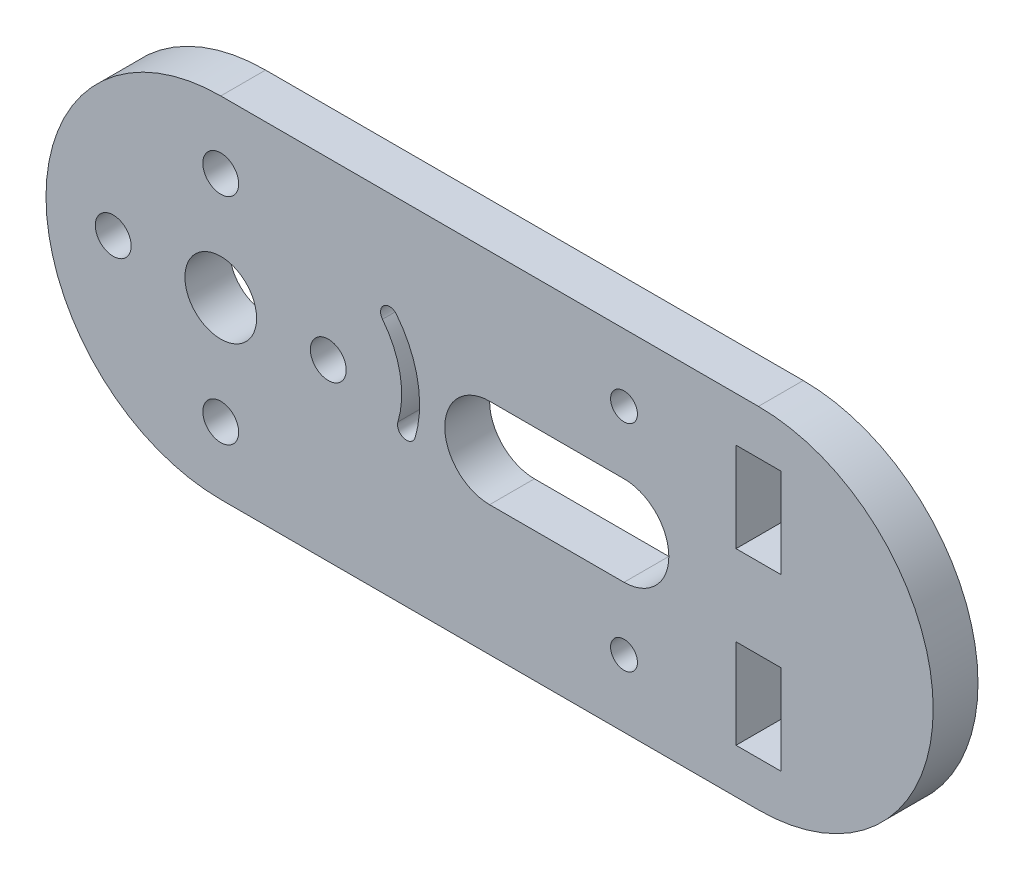
ISO-10303-21;
HEADER;
FILE_DESCRIPTION(('STEP AP214'),'2;1');
FILE_NAME('part.step','',(''),(''),'','','');
FILE_SCHEMA(('AUTOMOTIVE_DESIGN { 1 0 10303 214 1 1 1 1 }'));
ENDSEC;
DATA;
#1=APPLICATION_CONTEXT('core data for automotive mechanical design processes');
#2=APPLICATION_PROTOCOL_DEFINITION('international standard','automotive_design',2000,#1);
#3=PRODUCT_CONTEXT('',#1,'mechanical');
#4=PRODUCT('Part','Part','',(#3));
#5=PRODUCT_RELATED_PRODUCT_CATEGORY('part','',(#4));
#6=PRODUCT_DEFINITION_FORMATION('','',#4);
#7=PRODUCT_DEFINITION_CONTEXT('part definition',#1,'design');
#8=PRODUCT_DEFINITION('design','',#6,#7);
#9=PRODUCT_DEFINITION_SHAPE('','',#8);
#10=(LENGTH_UNIT() NAMED_UNIT(*) SI_UNIT(.MILLI.,.METRE.));
#11=(NAMED_UNIT(*) PLANE_ANGLE_UNIT() SI_UNIT($,.RADIAN.));
#12=(NAMED_UNIT(*) SI_UNIT($,.STERADIAN.) SOLID_ANGLE_UNIT());
#13=UNCERTAINTY_MEASURE_WITH_UNIT(LENGTH_MEASURE(1.E-05),#10,'distance_accuracy_value','');
#14=(GEOMETRIC_REPRESENTATION_CONTEXT(3) GLOBAL_UNCERTAINTY_ASSIGNED_CONTEXT((#13)) GLOBAL_UNIT_ASSIGNED_CONTEXT((#10,
#11,#12)) REPRESENTATION_CONTEXT('',''));
#15=CARTESIAN_POINT('',(0.,0.,0.));
#16=DIRECTION('',(0.,0.,1.));
#17=DIRECTION('',(1.,0.,0.));
#18=AXIS2_PLACEMENT_3D('',#15,#16,#17);
#19=CARTESIAN_POINT('',(-30.,0.,5.));
#20=DIRECTION('',(0.,0.,1.));
#21=DIRECTION('',(1.,0.,0.));
#22=AXIS2_PLACEMENT_3D('',#19,#20,#21);
#23=PLANE('',#22);
#24=CARTESIAN_POINT('',(15.,12.,5.));
#25=DIRECTION('',(0.,0.,1.));
#26=DIRECTION('',(1.,0.,0.));
#27=AXIS2_PLACEMENT_3D('',#24,#25,#26);
#28=CIRCLE('',#27,1.5);
#29=CARTESIAN_POINT('',(16.5,12.,5.));
#30=VERTEX_POINT('',#29);
#31=EDGE_CURVE('E304',#30,#30,#28,.T.);
#32=ORIENTED_EDGE('',*,*,#31,.F.);
#33=EDGE_LOOP('',(#32));
#34=FACE_BOUND('',#33,.T.);
#35=CARTESIAN_POINT('',(-30.,-12.,5.));
#36=DIRECTION('',(0.,0.,1.));
#37=DIRECTION('',(1.,0.,0.));
#38=AXIS2_PLACEMENT_3D('',#35,#36,#37);
#39=CIRCLE('',#38,2.);
#40=CARTESIAN_POINT('',(-28.,-12.,5.));
#41=VERTEX_POINT('',#40);
#42=EDGE_CURVE('E316',#41,#41,#39,.T.);
#43=ORIENTED_EDGE('',*,*,#42,.F.);
#44=EDGE_LOOP('',(#43));
#45=FACE_BOUND('',#44,.T.);
#46=CARTESIAN_POINT('',(-30.,12.,5.));
#47=DIRECTION('',(0.,0.,1.));
#48=DIRECTION('',(1.,0.,0.));
#49=AXIS2_PLACEMENT_3D('',#46,#47,#48);
#50=CIRCLE('',#49,2.);
#51=CARTESIAN_POINT('',(-28.,12.,5.));
#52=VERTEX_POINT('',#51);
#53=EDGE_CURVE('E328',#52,#52,#50,.T.);
#54=ORIENTED_EDGE('',*,*,#53,.F.);
#55=EDGE_LOOP('',(#54));
#56=FACE_BOUND('',#55,.T.);
#57=CARTESIAN_POINT('',(-30.,0.,5.));
#58=DIRECTION('',(0.,0.,1.));
#59=DIRECTION('',(1.,0.,0.));
#60=AXIS2_PLACEMENT_3D('',#57,#58,#59);
#61=CIRCLE('',#60,19.5);
#62=CARTESIAN_POINT('',(-30.,19.5,5.));
#63=VERTEX_POINT('',#62);
#64=CARTESIAN_POINT('',(-30.,-19.5,5.));
#65=VERTEX_POINT('',#64);
#66=EDGE_CURVE('E340',#63,#65,#61,.T.);
#67=ORIENTED_EDGE('',*,*,#66,.T.);
#68=DIRECTION('',(1.,0.,0.));
#69=VECTOR('',#68,1.);
#70=CARTESIAN_POINT('',(-30.,-19.5,5.));
#71=LINE('',#70,#69);
#72=CARTESIAN_POINT('',(30.,-19.5,5.));
#73=VERTEX_POINT('',#72);
#74=EDGE_CURVE('E343',#65,#73,#71,.T.);
#75=ORIENTED_EDGE('',*,*,#74,.T.);
#76=CARTESIAN_POINT('',(30.,0.,5.));
#77=DIRECTION('',(0.,0.,1.));
#78=DIRECTION('',(1.,0.,0.));
#79=AXIS2_PLACEMENT_3D('',#76,#77,#78);
#80=CIRCLE('',#79,19.5);
#81=CARTESIAN_POINT('',(30.,19.5,5.));
#82=VERTEX_POINT('',#81);
#83=EDGE_CURVE('E346',#73,#82,#80,.T.);
#84=ORIENTED_EDGE('',*,*,#83,.T.);
#85=DIRECTION('',(-1.,0.,0.));
#86=VECTOR('',#85,1.);
#87=CARTESIAN_POINT('',(-30.,19.5,5.));
#88=LINE('',#87,#86);
#89=EDGE_CURVE('E348',#82,#63,#88,.T.);
#90=ORIENTED_EDGE('',*,*,#89,.T.);
#91=EDGE_LOOP('',(#67,#75,#84,#90));
#92=FACE_BOUND('',#91,.T.);
#93=CARTESIAN_POINT('',(-30.,0.,5.));
#94=DIRECTION('',(0.,0.,1.));
#95=DIRECTION('',(1.,0.,0.));
#96=AXIS2_PLACEMENT_3D('',#93,#94,#95);
#97=CIRCLE('',#96,4.);
#98=CARTESIAN_POINT('',(-26.,0.,5.));
#99=VERTEX_POINT('',#98);
#100=EDGE_CURVE('E334',#99,#99,#97,.T.);
#101=ORIENTED_EDGE('',*,*,#100,.F.);
#102=EDGE_LOOP('',(#101));
#103=FACE_BOUND('',#102,.T.);
#104=CARTESIAN_POINT('',(-18.,0.,5.));
#105=DIRECTION('',(0.,0.,1.));
#106=DIRECTION('',(1.,0.,0.));
#107=AXIS2_PLACEMENT_3D('',#104,#105,#106);
#108=CIRCLE('',#107,2.);
#109=CARTESIAN_POINT('',(-16.,0.,5.));
#110=VERTEX_POINT('',#109);
#111=EDGE_CURVE('E322',#110,#110,#108,.T.);
#112=ORIENTED_EDGE('',*,*,#111,.F.);
#113=EDGE_LOOP('',(#112));
#114=FACE_BOUND('',#113,.T.);
#115=CARTESIAN_POINT('',(-42.,0.,5.));
#116=DIRECTION('',(0.,0.,1.));
#117=DIRECTION('',(1.,0.,0.));
#118=AXIS2_PLACEMENT_3D('',#115,#116,#117);
#119=CIRCLE('',#118,2.);
#120=CARTESIAN_POINT('',(-40.,0.,5.));
#121=VERTEX_POINT('',#120);
#122=EDGE_CURVE('E310',#121,#121,#119,.T.);
#123=ORIENTED_EDGE('',*,*,#122,.F.);
#124=EDGE_LOOP('',(#123));
#125=FACE_BOUND('',#124,.T.);
#126=CARTESIAN_POINT('',(15.,-12.,5.));
#127=DIRECTION('',(0.,0.,1.));
#128=DIRECTION('',(1.,0.,0.));
#129=AXIS2_PLACEMENT_3D('',#126,#127,#128);
#130=CIRCLE('',#129,1.5);
#131=CARTESIAN_POINT('',(16.5,-12.,5.));
#132=VERTEX_POINT('',#131);
#133=EDGE_CURVE('E298',#132,#132,#130,.T.);
#134=ORIENTED_EDGE('',*,*,#133,.F.);
#135=EDGE_LOOP('',(#134));
#136=FACE_BOUND('',#135,.T.);
#137=DIRECTION('',(-1.,0.,0.));
#138=VECTOR('',#137,1.);
#139=CARTESIAN_POINT('',(15.,5.,5.));
#140=LINE('',#139,#138);
#141=CARTESIAN_POINT('',(15.,5.,5.));
#142=VERTEX_POINT('',#141);
#143=CARTESIAN_POINT('',(0.,5.,5.));
#144=VERTEX_POINT('',#143);
#145=EDGE_CURVE('E269',#142,#144,#140,.T.);
#146=ORIENTED_EDGE('',*,*,#145,.F.);
#147=CARTESIAN_POINT('',(15.,0.,5.));
#148=DIRECTION('',(0.,0.,1.));
#149=DIRECTION('',(1.,0.,0.));
#150=AXIS2_PLACEMENT_3D('',#147,#148,#149);
#151=CIRCLE('',#150,5.);
#152=CARTESIAN_POINT('',(15.,-5.,5.));
#153=VERTEX_POINT('',#152);
#154=EDGE_CURVE('E267',#153,#142,#151,.T.);
#155=ORIENTED_EDGE('',*,*,#154,.F.);
#156=DIRECTION('',(1.,0.,0.));
#157=VECTOR('',#156,1.);
#158=CARTESIAN_POINT('',(15.,-5.,5.));
#159=LINE('',#158,#157);
#160=CARTESIAN_POINT('',(0.,-5.,5.));
#161=VERTEX_POINT('',#160);
#162=EDGE_CURVE('E275',#161,#153,#159,.T.);
#163=ORIENTED_EDGE('',*,*,#162,.F.);
#164=CARTESIAN_POINT('',(0.,0.,5.));
#165=DIRECTION('',(0.,0.,1.));
#166=DIRECTION('',(1.,0.,0.));
#167=AXIS2_PLACEMENT_3D('',#164,#165,#166);
#168=CIRCLE('',#167,5.);
#169=EDGE_CURVE('E272',#144,#161,#168,.T.);
#170=ORIENTED_EDGE('',*,*,#169,.F.);
#171=EDGE_LOOP('',(#146,#155,#163,#170));
#172=FACE_BOUND('',#171,.T.);
#173=CARTESIAN_POINT('',(-9.27407063497389,-2.40670280144582,5.));
#174=DIRECTION('',(0.,0.,1.));
#175=DIRECTION('',(1.,0.,0.));
#176=AXIS2_PLACEMENT_3D('',#173,#174,#175);
#177=CIRCLE('',#176,1.);
#178=CARTESIAN_POINT('',(-10.231740031791,-2.11883247230441,5.));
#179=VERTEX_POINT('',#178);
#180=CARTESIAN_POINT('',(-8.31640123815679,-2.69457313058723,5.));
#181=VERTEX_POINT('',#180);
#182=EDGE_CURVE('E238',#179,#181,#177,.T.);
#183=ORIENTED_EDGE('',*,*,#182,.F.);
#184=CARTESIAN_POINT('',(-19.8084339999619,0.759870819109661,5.));
#185=DIRECTION('',(0.,0.,-1.));
#186=DIRECTION('',(1.,0.,0.));
#187=AXIS2_PLACEMENT_3D('',#184,#185,#186);
#188=CIRCLE('',#187,10.);
#189=CARTESIAN_POINT('',(-11.9503160834255,6.94452786779143,5.));
#190=VERTEX_POINT('',#189);
#191=EDGE_CURVE('E236',#190,#179,#188,.T.);
#192=ORIENTED_EDGE('',*,*,#191,.F.);
#193=CARTESIAN_POINT('',(-11.1645042917718,7.5629935726596,5.));
#194=DIRECTION('',(0.,0.,1.));
#195=DIRECTION('',(-1.,0.,0.));
#196=AXIS2_PLACEMENT_3D('',#193,#194,#195);
#197=CIRCLE('',#196,1.);
#198=CARTESIAN_POINT('',(-10.3786925001182,8.18145927752778,5.));
#199=VERTEX_POINT('',#198);
#200=EDGE_CURVE('E244',#199,#190,#197,.T.);
#201=ORIENTED_EDGE('',*,*,#200,.F.);
#202=CARTESIAN_POINT('',(-19.8084339999619,0.759870819109661,5.));
#203=DIRECTION('',(0.,0.,1.));
#204=DIRECTION('',(1.,0.,0.));
#205=AXIS2_PLACEMENT_3D('',#202,#203,#204);
#206=CIRCLE('',#205,12.);
#207=EDGE_CURVE('E241',#181,#199,#206,.T.);
#208=ORIENTED_EDGE('',*,*,#207,.F.);
#209=EDGE_LOOP('',(#183,#192,#201,#208));
#210=FACE_BOUND('',#209,.T.);
#211=DIRECTION('',(1.,0.,0.));
#212=VECTOR('',#211,1.);
#213=CARTESIAN_POINT('',(32.4999999999999,4.50000000000001,5.));
#214=LINE('',#213,#212);
#215=CARTESIAN_POINT('',(27.4999999999999,4.50000000000001,5.));
#216=VERTEX_POINT('',#215);
#217=CARTESIAN_POINT('',(32.4999999999999,4.50000000000001,5.));
#218=VERTEX_POINT('',#217);
#219=EDGE_CURVE('E207',#216,#218,#214,.T.);
#220=ORIENTED_EDGE('',*,*,#219,.F.);
#221=DIRECTION('',(0.,-1.,0.));
#222=VECTOR('',#221,1.);
#223=CARTESIAN_POINT('',(27.4999999999999,4.50000000000001,5.));
#224=LINE('',#223,#222);
#225=CARTESIAN_POINT('',(27.4999999999999,14.5,5.));
#226=VERTEX_POINT('',#225);
#227=EDGE_CURVE('E205',#226,#216,#224,.T.);
#228=ORIENTED_EDGE('',*,*,#227,.F.);
#229=DIRECTION('',(-1.,0.,0.));
#230=VECTOR('',#229,1.);
#231=CARTESIAN_POINT('',(27.4999999999999,14.5,5.));
#232=LINE('',#231,#230);
#233=CARTESIAN_POINT('',(32.4999999999999,14.5,5.));
#234=VERTEX_POINT('',#233);
#235=EDGE_CURVE('E213',#234,#226,#232,.T.);
#236=ORIENTED_EDGE('',*,*,#235,.F.);
#237=DIRECTION('',(0.,1.,0.));
#238=VECTOR('',#237,1.);
#239=CARTESIAN_POINT('',(32.4999999999999,14.5,5.));
#240=LINE('',#239,#238);
#241=EDGE_CURVE('E210',#218,#234,#240,.T.);
#242=ORIENTED_EDGE('',*,*,#241,.F.);
#243=EDGE_LOOP('',(#220,#228,#236,#242));
#244=FACE_BOUND('',#243,.T.);
#245=DIRECTION('',(-1.,0.,0.));
#246=VECTOR('',#245,1.);
#247=CARTESIAN_POINT('',(32.4999999999999,-4.5,5.));
#248=LINE('',#247,#246);
#249=CARTESIAN_POINT('',(32.4999999999999,-4.5,5.));
#250=VERTEX_POINT('',#249);
#251=CARTESIAN_POINT('',(27.4999999999999,-4.5,5.));
#252=VERTEX_POINT('',#251);
#253=EDGE_CURVE('E177',#250,#252,#248,.T.);
#254=ORIENTED_EDGE('',*,*,#253,.F.);
#255=DIRECTION('',(0.,1.,0.));
#256=VECTOR('',#255,1.);
#257=CARTESIAN_POINT('',(32.4999999999999,-14.5,5.));
#258=LINE('',#257,#256);
#259=CARTESIAN_POINT('',(32.4999999999999,-14.5,5.));
#260=VERTEX_POINT('',#259);
#261=EDGE_CURVE('E169',#260,#250,#258,.T.);
#262=ORIENTED_EDGE('',*,*,#261,.F.);
#263=DIRECTION('',(1.,0.,0.));
#264=VECTOR('',#263,1.);
#265=CARTESIAN_POINT('',(27.5000000000005,-14.5,5.));
#266=LINE('',#265,#264);
#267=CARTESIAN_POINT('',(27.5000000000005,-14.5,5.));
#268=VERTEX_POINT('',#267);
#269=EDGE_CURVE('E191',#268,#260,#266,.T.);
#270=ORIENTED_EDGE('',*,*,#269,.F.);
#271=DIRECTION('',(0.,-1.,0.));
#272=VECTOR('',#271,1.);
#273=CARTESIAN_POINT('',(27.4999999999999,-4.5,5.));
#274=LINE('',#273,#272);
#275=EDGE_CURVE('E189',#252,#268,#274,.T.);
#276=ORIENTED_EDGE('',*,*,#275,.F.);
#277=EDGE_LOOP('',(#254,#262,#270,#276));
#278=FACE_BOUND('',#277,.T.);
#279=ADVANCED_FACE('F32',(#34,#45,#56,#92,#103,#114,#125,#136,#172,#210,#244,#278),#23,.T.);
#280=CARTESIAN_POINT('',(-30.,0.,0.));
#281=DIRECTION('',(0.,0.,1.));
#282=DIRECTION('',(1.,0.,0.));
#283=AXIS2_PLACEMENT_3D('',#280,#281,#282);
#284=PLANE('',#283);
#285=DIRECTION('',(0.,-1.,0.));
#286=VECTOR('',#285,1.);
#287=CARTESIAN_POINT('',(27.4999999999999,4.50000000000001,0.));
#288=LINE('',#287,#286);
#289=CARTESIAN_POINT('',(27.4999999999999,14.5,0.));
#290=VERTEX_POINT('',#289);
#291=CARTESIAN_POINT('',(27.4999999999999,4.50000000000001,0.));
#292=VERTEX_POINT('',#291);
#293=EDGE_CURVE('E185',#290,#292,#288,.T.);
#294=ORIENTED_EDGE('',*,*,#293,.T.);
#295=DIRECTION('',(1.,0.,0.));
#296=VECTOR('',#295,1.);
#297=CARTESIAN_POINT('',(32.4999999999999,4.50000000000001,0.));
#298=LINE('',#297,#296);
#299=CARTESIAN_POINT('',(32.4999999999999,4.50000000000001,0.));
#300=VERTEX_POINT('',#299);
#301=EDGE_CURVE('E218',#292,#300,#298,.T.);
#302=ORIENTED_EDGE('',*,*,#301,.T.);
#303=DIRECTION('',(0.,1.,0.));
#304=VECTOR('',#303,1.);
#305=CARTESIAN_POINT('',(32.4999999999999,14.5,0.));
#306=LINE('',#305,#304);
#307=CARTESIAN_POINT('',(32.4999999999999,14.5,0.));
#308=VERTEX_POINT('',#307);
#309=EDGE_CURVE('E221',#300,#308,#306,.T.);
#310=ORIENTED_EDGE('',*,*,#309,.T.);
#311=DIRECTION('',(-1.,0.,0.));
#312=VECTOR('',#311,1.);
#313=CARTESIAN_POINT('',(27.4999999999999,14.5,0.));
#314=LINE('',#313,#312);
#315=EDGE_CURVE('E208',#308,#290,#314,.T.);
#316=ORIENTED_EDGE('',*,*,#315,.T.);
#317=EDGE_LOOP('',(#294,#302,#310,#316));
#318=FACE_BOUND('',#317,.T.);
#319=CARTESIAN_POINT('',(15.,0.,0.));
#320=DIRECTION('',(0.,0.,1.));
#321=DIRECTION('',(1.,0.,0.));
#322=AXIS2_PLACEMENT_3D('',#319,#320,#321);
#323=CIRCLE('',#322,5.);
#324=CARTESIAN_POINT('',(15.,-5.,0.));
#325=VERTEX_POINT('',#324);
#326=CARTESIAN_POINT('',(15.,5.,0.));
#327=VERTEX_POINT('',#326);
#328=EDGE_CURVE('E266',#325,#327,#323,.T.);
#329=ORIENTED_EDGE('',*,*,#328,.T.);
#330=DIRECTION('',(-1.,0.,0.));
#331=VECTOR('',#330,1.);
#332=CARTESIAN_POINT('',(15.,5.,0.));
#333=LINE('',#332,#331);
#334=CARTESIAN_POINT('',(0.,5.,0.));
#335=VERTEX_POINT('',#334);
#336=EDGE_CURVE('E280',#327,#335,#333,.T.);
#337=ORIENTED_EDGE('',*,*,#336,.T.);
#338=CARTESIAN_POINT('',(0.,0.,0.));
#339=DIRECTION('',(0.,0.,1.));
#340=DIRECTION('',(1.,0.,0.));
#341=AXIS2_PLACEMENT_3D('',#338,#339,#340);
#342=CIRCLE('',#341,5.);
#343=CARTESIAN_POINT('',(0.,-5.,0.));
#344=VERTEX_POINT('',#343);
#345=EDGE_CURVE('E283',#335,#344,#342,.T.);
#346=ORIENTED_EDGE('',*,*,#345,.T.);
#347=DIRECTION('',(1.,0.,0.));
#348=VECTOR('',#347,1.);
#349=CARTESIAN_POINT('',(15.,-5.,0.));
#350=LINE('',#349,#348);
#351=EDGE_CURVE('E270',#344,#325,#350,.T.);
#352=ORIENTED_EDGE('',*,*,#351,.T.);
#353=EDGE_LOOP('',(#329,#337,#346,#352));
#354=FACE_BOUND('',#353,.T.);
#355=CARTESIAN_POINT('',(-30.,0.,0.));
#356=DIRECTION('',(0.,0.,1.));
#357=DIRECTION('',(1.,0.,0.));
#358=AXIS2_PLACEMENT_3D('',#355,#356,#357);
#359=CIRCLE('',#358,19.5);
#360=CARTESIAN_POINT('',(-30.,19.5,0.));
#361=VERTEX_POINT('',#360);
#362=CARTESIAN_POINT('',(-30.,-19.5,0.));
#363=VERTEX_POINT('',#362);
#364=EDGE_CURVE('E337',#361,#363,#359,.T.);
#365=ORIENTED_EDGE('',*,*,#364,.F.);
#366=DIRECTION('',(-1.,0.,0.));
#367=VECTOR('',#366,1.);
#368=CARTESIAN_POINT('',(-30.,19.5,0.));
#369=LINE('',#368,#367);
#370=CARTESIAN_POINT('',(30.,19.5,0.));
#371=VERTEX_POINT('',#370);
#372=EDGE_CURVE('E344',#371,#361,#369,.T.);
#373=ORIENTED_EDGE('',*,*,#372,.F.);
#374=CARTESIAN_POINT('',(30.,0.,0.));
#375=DIRECTION('',(0.,0.,1.));
#376=DIRECTION('',(1.,0.,0.));
#377=AXIS2_PLACEMENT_3D('',#374,#375,#376);
#378=CIRCLE('',#377,19.5);
#379=CARTESIAN_POINT('',(30.,-19.5,0.));
#380=VERTEX_POINT('',#379);
#381=EDGE_CURVE('E355',#380,#371,#378,.T.);
#382=ORIENTED_EDGE('',*,*,#381,.F.);
#383=DIRECTION('',(1.,0.,0.));
#384=VECTOR('',#383,1.);
#385=CARTESIAN_POINT('',(-30.,-19.5,0.));
#386=LINE('',#385,#384);
#387=EDGE_CURVE('E353',#363,#380,#386,.T.);
#388=ORIENTED_EDGE('',*,*,#387,.F.);
#389=EDGE_LOOP('',(#365,#373,#382,#388));
#390=FACE_BOUND('',#389,.T.);
#391=CARTESIAN_POINT('',(-30.,0.,0.));
#392=DIRECTION('',(0.,0.,1.));
#393=DIRECTION('',(1.,0.,0.));
#394=AXIS2_PLACEMENT_3D('',#391,#392,#393);
#395=CIRCLE('',#394,4.);
#396=CARTESIAN_POINT('',(-26.,0.,0.));
#397=VERTEX_POINT('',#396);
#398=EDGE_CURVE('E331',#397,#397,#395,.T.);
#399=ORIENTED_EDGE('',*,*,#398,.T.);
#400=EDGE_LOOP('',(#399));
#401=FACE_BOUND('',#400,.T.);
#402=CARTESIAN_POINT('',(-30.,12.,0.));
#403=DIRECTION('',(0.,0.,1.));
#404=DIRECTION('',(1.,0.,0.));
#405=AXIS2_PLACEMENT_3D('',#402,#403,#404);
#406=CIRCLE('',#405,2.);
#407=CARTESIAN_POINT('',(-28.,12.,0.));
#408=VERTEX_POINT('',#407);
#409=EDGE_CURVE('E325',#408,#408,#406,.T.);
#410=ORIENTED_EDGE('',*,*,#409,.T.);
#411=EDGE_LOOP('',(#410));
#412=FACE_BOUND('',#411,.T.);
#413=CARTESIAN_POINT('',(-18.,0.,0.));
#414=DIRECTION('',(0.,0.,1.));
#415=DIRECTION('',(1.,0.,0.));
#416=AXIS2_PLACEMENT_3D('',#413,#414,#415);
#417=CIRCLE('',#416,2.);
#418=CARTESIAN_POINT('',(-16.,0.,0.));
#419=VERTEX_POINT('',#418);
#420=EDGE_CURVE('E319',#419,#419,#417,.T.);
#421=ORIENTED_EDGE('',*,*,#420,.T.);
#422=EDGE_LOOP('',(#421));
#423=FACE_BOUND('',#422,.T.);
#424=CARTESIAN_POINT('',(-30.,-12.,0.));
#425=DIRECTION('',(0.,0.,1.));
#426=DIRECTION('',(1.,0.,0.));
#427=AXIS2_PLACEMENT_3D('',#424,#425,#426);
#428=CIRCLE('',#427,2.);
#429=CARTESIAN_POINT('',(-28.,-12.,0.));
#430=VERTEX_POINT('',#429);
#431=EDGE_CURVE('E313',#430,#430,#428,.T.);
#432=ORIENTED_EDGE('',*,*,#431,.T.);
#433=EDGE_LOOP('',(#432));
#434=FACE_BOUND('',#433,.T.);
#435=CARTESIAN_POINT('',(-42.,0.,0.));
#436=DIRECTION('',(0.,0.,1.));
#437=DIRECTION('',(1.,0.,0.));
#438=AXIS2_PLACEMENT_3D('',#435,#436,#437);
#439=CIRCLE('',#438,2.);
#440=CARTESIAN_POINT('',(-40.,0.,0.));
#441=VERTEX_POINT('',#440);
#442=EDGE_CURVE('E307',#441,#441,#439,.T.);
#443=ORIENTED_EDGE('',*,*,#442,.T.);
#444=EDGE_LOOP('',(#443));
#445=FACE_BOUND('',#444,.T.);
#446=CARTESIAN_POINT('',(15.,12.,0.));
#447=DIRECTION('',(0.,0.,1.));
#448=DIRECTION('',(1.,0.,0.));
#449=AXIS2_PLACEMENT_3D('',#446,#447,#448);
#450=CIRCLE('',#449,1.5);
#451=CARTESIAN_POINT('',(16.5,12.,0.));
#452=VERTEX_POINT('',#451);
#453=EDGE_CURVE('E301',#452,#452,#450,.T.);
#454=ORIENTED_EDGE('',*,*,#453,.T.);
#455=EDGE_LOOP('',(#454));
#456=FACE_BOUND('',#455,.T.);
#457=CARTESIAN_POINT('',(15.,-12.,0.));
#458=DIRECTION('',(0.,0.,1.));
#459=DIRECTION('',(1.,0.,0.));
#460=AXIS2_PLACEMENT_3D('',#457,#458,#459);
#461=CIRCLE('',#460,1.5);
#462=CARTESIAN_POINT('',(16.5,-12.,0.));
#463=VERTEX_POINT('',#462);
#464=EDGE_CURVE('E297',#463,#463,#461,.T.);
#465=ORIENTED_EDGE('',*,*,#464,.T.);
#466=EDGE_LOOP('',(#465));
#467=FACE_BOUND('',#466,.T.);
#468=CARTESIAN_POINT('',(-19.8084339999619,0.759870819109661,0.));
#469=DIRECTION('',(0.,0.,-1.));
#470=DIRECTION('',(1.,0.,0.));
#471=AXIS2_PLACEMENT_3D('',#468,#469,#470);
#472=CIRCLE('',#471,10.);
#473=CARTESIAN_POINT('',(-11.9503160834255,6.94452786779143,0.));
#474=VERTEX_POINT('',#473);
#475=CARTESIAN_POINT('',(-10.231740031791,-2.11883247230441,0.));
#476=VERTEX_POINT('',#475);
#477=EDGE_CURVE('E235',#474,#476,#472,.T.);
#478=ORIENTED_EDGE('',*,*,#477,.T.);
#479=CARTESIAN_POINT('',(-9.27407063497389,-2.40670280144582,0.));
#480=DIRECTION('',(0.,0.,1.));
#481=DIRECTION('',(1.,0.,0.));
#482=AXIS2_PLACEMENT_3D('',#479,#480,#481);
#483=CIRCLE('',#482,1.);
#484=CARTESIAN_POINT('',(-8.31640123815679,-2.69457313058723,0.));
#485=VERTEX_POINT('',#484);
#486=EDGE_CURVE('E249',#476,#485,#483,.T.);
#487=ORIENTED_EDGE('',*,*,#486,.T.);
#488=CARTESIAN_POINT('',(-19.8084339999619,0.759870819109661,0.));
#489=DIRECTION('',(0.,0.,1.));
#490=DIRECTION('',(1.,0.,0.));
#491=AXIS2_PLACEMENT_3D('',#488,#489,#490);
#492=CIRCLE('',#491,12.);
#493=CARTESIAN_POINT('',(-10.3786925001182,8.18145927752778,0.));
#494=VERTEX_POINT('',#493);
#495=EDGE_CURVE('E252',#485,#494,#492,.T.);
#496=ORIENTED_EDGE('',*,*,#495,.T.);
#497=CARTESIAN_POINT('',(-11.1645042917718,7.5629935726596,0.));
#498=DIRECTION('',(0.,0.,1.));
#499=DIRECTION('',(-1.,0.,0.));
#500=AXIS2_PLACEMENT_3D('',#497,#498,#499);
#501=CIRCLE('',#500,1.);
#502=EDGE_CURVE('E239',#494,#474,#501,.T.);
#503=ORIENTED_EDGE('',*,*,#502,.T.);
#504=EDGE_LOOP('',(#478,#487,#496,#503));
#505=FACE_BOUND('',#504,.T.);
#506=DIRECTION('',(0.,1.,0.));
#507=VECTOR('',#506,1.);
#508=CARTESIAN_POINT('',(32.4999999999999,-14.5,0.));
#509=LINE('',#508,#507);
#510=CARTESIAN_POINT('',(32.4999999999999,-14.5,0.));
#511=VERTEX_POINT('',#510);
#512=CARTESIAN_POINT('',(32.4999999999999,-4.5,0.));
#513=VERTEX_POINT('',#512);
#514=EDGE_CURVE('E55',#511,#513,#509,.T.);
#515=ORIENTED_EDGE('',*,*,#514,.T.);
#516=DIRECTION('',(-1.,0.,0.));
#517=VECTOR('',#516,1.);
#518=CARTESIAN_POINT('',(32.4999999999999,-4.5,0.));
#519=LINE('',#518,#517);
#520=CARTESIAN_POINT('',(27.4999999999999,-4.5,0.));
#521=VERTEX_POINT('',#520);
#522=EDGE_CURVE('E184',#513,#521,#519,.T.);
#523=ORIENTED_EDGE('',*,*,#522,.T.);
#524=DIRECTION('',(0.,-1.,0.));
#525=VECTOR('',#524,1.);
#526=CARTESIAN_POINT('',(27.4999999999999,-4.5,0.));
#527=LINE('',#526,#525);
#528=CARTESIAN_POINT('',(27.5000000000005,-14.5,0.));
#529=VERTEX_POINT('',#528);
#530=EDGE_CURVE('E197',#521,#529,#527,.T.);
#531=ORIENTED_EDGE('',*,*,#530,.T.);
#532=DIRECTION('',(1.,0.,0.));
#533=VECTOR('',#532,1.);
#534=CARTESIAN_POINT('',(27.5000000000005,-14.5,0.));
#535=LINE('',#534,#533);
#536=EDGE_CURVE('E178',#529,#511,#535,.T.);
#537=ORIENTED_EDGE('',*,*,#536,.T.);
#538=EDGE_LOOP('',(#515,#523,#531,#537));
#539=FACE_BOUND('',#538,.T.);
#540=ADVANCED_FACE('F373',(#318,#354,#390,#401,#412,#423,#434,#445,#456,#467,#505,#539),#284,.F.);
#541=CARTESIAN_POINT('',(-30.,0.,5.));
#542=DIRECTION('',(0.,0.,-1.));
#543=DIRECTION('',(-1.,0.,0.));
#544=AXIS2_PLACEMENT_3D('',#541,#542,#543);
#545=CYLINDRICAL_SURFACE('',#544,19.5);
#546=ORIENTED_EDGE('',*,*,#364,.T.);
#547=DIRECTION('',(0.,0.,-1.));
#548=VECTOR('',#547,1.);
#549=CARTESIAN_POINT('',(-30.,-19.5,5.));
#550=LINE('',#549,#548);
#551=EDGE_CURVE('E11',#65,#363,#550,.T.);
#552=ORIENTED_EDGE('',*,*,#551,.F.);
#553=ORIENTED_EDGE('',*,*,#66,.F.);
#554=DIRECTION('',(0.,0.,-1.));
#555=VECTOR('',#554,1.);
#556=CARTESIAN_POINT('',(-30.,19.5,5.));
#557=LINE('',#556,#555);
#558=EDGE_CURVE('E350',#63,#361,#557,.T.);
#559=ORIENTED_EDGE('',*,*,#558,.T.);
#560=EDGE_LOOP('',(#546,#552,#553,#559));
#561=FACE_BOUND('',#560,.T.);
#562=ADVANCED_FACE('F34',(#561),#545,.T.);
#563=CARTESIAN_POINT('',(-30.,-19.5,5.));
#564=DIRECTION('',(0.,1.,0.));
#565=DIRECTION('',(0.,0.,1.));
#566=AXIS2_PLACEMENT_3D('',#563,#564,#565);
#567=PLANE('',#566);
#568=ORIENTED_EDGE('',*,*,#387,.T.);
#569=DIRECTION('',(0.,0.,-1.));
#570=VECTOR('',#569,1.);
#571=CARTESIAN_POINT('',(30.,-19.5,5.));
#572=LINE('',#571,#570);
#573=EDGE_CURVE('E40',#73,#380,#572,.T.);
#574=ORIENTED_EDGE('',*,*,#573,.F.);
#575=ORIENTED_EDGE('',*,*,#74,.F.);
#576=ORIENTED_EDGE('',*,*,#551,.T.);
#577=EDGE_LOOP('',(#568,#574,#575,#576));
#578=FACE_BOUND('',#577,.T.);
#579=ADVANCED_FACE('F384',(#578),#567,.F.);
#580=CARTESIAN_POINT('',(30.,0.,5.));
#581=DIRECTION('',(0.,0.,-1.));
#582=DIRECTION('',(-1.,0.,0.));
#583=AXIS2_PLACEMENT_3D('',#580,#581,#582);
#584=CYLINDRICAL_SURFACE('',#583,19.5);
#585=ORIENTED_EDGE('',*,*,#381,.T.);
#586=DIRECTION('',(0.,0.,-1.));
#587=VECTOR('',#586,1.);
#588=CARTESIAN_POINT('',(30.,19.5,5.));
#589=LINE('',#588,#587);
#590=EDGE_CURVE('E360',#82,#371,#589,.T.);
#591=ORIENTED_EDGE('',*,*,#590,.F.);
#592=ORIENTED_EDGE('',*,*,#83,.F.);
#593=ORIENTED_EDGE('',*,*,#573,.T.);
#594=EDGE_LOOP('',(#585,#591,#592,#593));
#595=FACE_BOUND('',#594,.T.);
#596=ADVANCED_FACE('F367',(#595),#584,.T.);
#597=CARTESIAN_POINT('',(-30.,19.5,5.));
#598=DIRECTION('',(0.,-1.,0.));
#599=DIRECTION('',(0.,0.,-1.));
#600=AXIS2_PLACEMENT_3D('',#597,#598,#599);
#601=PLANE('',#600);
#602=ORIENTED_EDGE('',*,*,#372,.T.);
#603=ORIENTED_EDGE('',*,*,#558,.F.);
#604=ORIENTED_EDGE('',*,*,#89,.F.);
#605=ORIENTED_EDGE('',*,*,#590,.T.);
#606=EDGE_LOOP('',(#602,#603,#604,#605));
#607=FACE_BOUND('',#606,.T.);
#608=ADVANCED_FACE('F377',(#607),#601,.F.);
#609=CARTESIAN_POINT('',(-30.,0.,5.));
#610=DIRECTION('',(0.,0.,-1.));
#611=DIRECTION('',(-1.,0.,0.));
#612=AXIS2_PLACEMENT_3D('',#609,#610,#611);
#613=CYLINDRICAL_SURFACE('',#612,4.);
#614=ORIENTED_EDGE('',*,*,#100,.T.);
#615=EDGE_LOOP('',(#614));
#616=FACE_BOUND('',#615,.T.);
#617=ORIENTED_EDGE('',*,*,#398,.F.);
#618=EDGE_LOOP('',(#617));
#619=FACE_BOUND('',#618,.T.);
#620=ADVANCED_FACE('F402',(#616,#619),#613,.F.);
#621=CARTESIAN_POINT('',(-30.,12.,5.));
#622=DIRECTION('',(0.,0.,-1.));
#623=DIRECTION('',(-1.,0.,0.));
#624=AXIS2_PLACEMENT_3D('',#621,#622,#623);
#625=CYLINDRICAL_SURFACE('',#624,2.);
#626=ORIENTED_EDGE('',*,*,#53,.T.);
#627=EDGE_LOOP('',(#626));
#628=FACE_BOUND('',#627,.T.);
#629=ORIENTED_EDGE('',*,*,#409,.F.);
#630=EDGE_LOOP('',(#629));
#631=FACE_BOUND('',#630,.T.);
#632=ADVANCED_FACE('F409',(#628,#631),#625,.F.);
#633=CARTESIAN_POINT('',(-18.,0.,5.));
#634=DIRECTION('',(0.,0.,-1.));
#635=DIRECTION('',(-1.,0.,0.));
#636=AXIS2_PLACEMENT_3D('',#633,#634,#635);
#637=CYLINDRICAL_SURFACE('',#636,2.);
#638=ORIENTED_EDGE('',*,*,#111,.T.);
#639=EDGE_LOOP('',(#638));
#640=FACE_BOUND('',#639,.T.);
#641=ORIENTED_EDGE('',*,*,#420,.F.);
#642=EDGE_LOOP('',(#641));
#643=FACE_BOUND('',#642,.T.);
#644=ADVANCED_FACE('F414',(#640,#643),#637,.F.);
#645=CARTESIAN_POINT('',(-30.,-12.,5.));
#646=DIRECTION('',(0.,0.,-1.));
#647=DIRECTION('',(-1.,0.,0.));
#648=AXIS2_PLACEMENT_3D('',#645,#646,#647);
#649=CYLINDRICAL_SURFACE('',#648,2.);
#650=ORIENTED_EDGE('',*,*,#42,.T.);
#651=EDGE_LOOP('',(#650));
#652=FACE_BOUND('',#651,.T.);
#653=ORIENTED_EDGE('',*,*,#431,.F.);
#654=EDGE_LOOP('',(#653));
#655=FACE_BOUND('',#654,.T.);
#656=ADVANCED_FACE('F507',(#652,#655),#649,.F.);
#657=CARTESIAN_POINT('',(-42.,0.,5.));
#658=DIRECTION('',(0.,0.,-1.));
#659=DIRECTION('',(-1.,0.,0.));
#660=AXIS2_PLACEMENT_3D('',#657,#658,#659);
#661=CYLINDRICAL_SURFACE('',#660,2.);
#662=ORIENTED_EDGE('',*,*,#122,.T.);
#663=EDGE_LOOP('',(#662));
#664=FACE_BOUND('',#663,.T.);
#665=ORIENTED_EDGE('',*,*,#442,.F.);
#666=EDGE_LOOP('',(#665));
#667=FACE_BOUND('',#666,.T.);
#668=ADVANCED_FACE('F503',(#664,#667),#661,.F.);
#669=CARTESIAN_POINT('',(15.,12.,5.));
#670=DIRECTION('',(0.,0.,-1.));
#671=DIRECTION('',(-1.,0.,0.));
#672=AXIS2_PLACEMENT_3D('',#669,#670,#671);
#673=CYLINDRICAL_SURFACE('',#672,1.5);
#674=ORIENTED_EDGE('',*,*,#31,.T.);
#675=EDGE_LOOP('',(#674));
#676=FACE_BOUND('',#675,.T.);
#677=ORIENTED_EDGE('',*,*,#453,.F.);
#678=EDGE_LOOP('',(#677));
#679=FACE_BOUND('',#678,.T.);
#680=ADVANCED_FACE('F499',(#676,#679),#673,.F.);
#681=CARTESIAN_POINT('',(15.,-12.,5.));
#682=DIRECTION('',(0.,0.,-1.));
#683=DIRECTION('',(-1.,0.,0.));
#684=AXIS2_PLACEMENT_3D('',#681,#682,#683);
#685=CYLINDRICAL_SURFACE('',#684,1.5);
#686=ORIENTED_EDGE('',*,*,#133,.T.);
#687=EDGE_LOOP('',(#686));
#688=FACE_BOUND('',#687,.T.);
#689=ORIENTED_EDGE('',*,*,#464,.F.);
#690=EDGE_LOOP('',(#689));
#691=FACE_BOUND('',#690,.T.);
#692=ADVANCED_FACE('F495',(#688,#691),#685,.F.);
#693=CARTESIAN_POINT('',(15.,0.,5.));
#694=DIRECTION('',(0.,0.,-1.));
#695=DIRECTION('',(-1.,0.,0.));
#696=AXIS2_PLACEMENT_3D('',#693,#694,#695);
#697=CYLINDRICAL_SURFACE('',#696,5.);
#698=ORIENTED_EDGE('',*,*,#328,.F.);
#699=DIRECTION('',(0.,0.,-1.));
#700=VECTOR('',#699,1.);
#701=CARTESIAN_POINT('',(15.,-5.,5.));
#702=LINE('',#701,#700);
#703=EDGE_CURVE('E277',#153,#325,#702,.T.);
#704=ORIENTED_EDGE('',*,*,#703,.F.);
#705=ORIENTED_EDGE('',*,*,#154,.T.);
#706=DIRECTION('',(0.,0.,-1.));
#707=VECTOR('',#706,1.);
#708=CARTESIAN_POINT('',(15.,5.,5.));
#709=LINE('',#708,#707);
#710=EDGE_CURVE('E294',#142,#327,#709,.T.);
#711=ORIENTED_EDGE('',*,*,#710,.T.);
#712=EDGE_LOOP('',(#698,#704,#705,#711));
#713=FACE_BOUND('',#712,.T.);
#714=ADVANCED_FACE('F491',(#713),#697,.F.);
#715=CARTESIAN_POINT('',(15.,5.,5.));
#716=DIRECTION('',(0.,-1.,0.));
#717=DIRECTION('',(0.,0.,-1.));
#718=AXIS2_PLACEMENT_3D('',#715,#716,#717);
#719=PLANE('',#718);
#720=ORIENTED_EDGE('',*,*,#336,.F.);
#721=ORIENTED_EDGE('',*,*,#710,.F.);
#722=ORIENTED_EDGE('',*,*,#145,.T.);
#723=DIRECTION('',(0.,0.,-1.));
#724=VECTOR('',#723,1.);
#725=CARTESIAN_POINT('',(0.,5.,5.));
#726=LINE('',#725,#724);
#727=EDGE_CURVE('E292',#144,#335,#726,.T.);
#728=ORIENTED_EDGE('',*,*,#727,.T.);
#729=EDGE_LOOP('',(#720,#721,#722,#728));
#730=FACE_BOUND('',#729,.T.);
#731=ADVANCED_FACE('F487',(#730),#719,.T.);
#732=CARTESIAN_POINT('',(0.,0.,5.));
#733=DIRECTION('',(0.,0.,-1.));
#734=DIRECTION('',(-1.,0.,0.));
#735=AXIS2_PLACEMENT_3D('',#732,#733,#734);
#736=CYLINDRICAL_SURFACE('',#735,5.);
#737=ORIENTED_EDGE('',*,*,#345,.F.);
#738=ORIENTED_EDGE('',*,*,#727,.F.);
#739=ORIENTED_EDGE('',*,*,#169,.T.);
#740=DIRECTION('',(0.,0.,-1.));
#741=VECTOR('',#740,1.);
#742=CARTESIAN_POINT('',(0.,-5.,5.));
#743=LINE('',#742,#741);
#744=EDGE_CURVE('E290',#161,#344,#743,.T.);
#745=ORIENTED_EDGE('',*,*,#744,.T.);
#746=EDGE_LOOP('',(#737,#738,#739,#745));
#747=FACE_BOUND('',#746,.T.);
#748=ADVANCED_FACE('F483',(#747),#736,.F.);
#749=CARTESIAN_POINT('',(15.,-5.,5.));
#750=DIRECTION('',(0.,1.,0.));
#751=DIRECTION('',(0.,0.,1.));
#752=AXIS2_PLACEMENT_3D('',#749,#750,#751);
#753=PLANE('',#752);
#754=ORIENTED_EDGE('',*,*,#351,.F.);
#755=ORIENTED_EDGE('',*,*,#744,.F.);
#756=ORIENTED_EDGE('',*,*,#162,.T.);
#757=ORIENTED_EDGE('',*,*,#703,.T.);
#758=EDGE_LOOP('',(#754,#755,#756,#757));
#759=FACE_BOUND('',#758,.T.);
#760=ADVANCED_FACE('F479',(#759),#753,.T.);
#761=CARTESIAN_POINT('',(-19.8084339999619,0.759870819109661,5.));
#762=DIRECTION('',(0.,0.,-1.));
#763=DIRECTION('',(-1.,0.,0.));
#764=AXIS2_PLACEMENT_3D('',#761,#762,#763);
#765=CYLINDRICAL_SURFACE('',#764,10.);
#766=ORIENTED_EDGE('',*,*,#477,.F.);
#767=DIRECTION('',(0.,0.,-1.));
#768=VECTOR('',#767,1.);
#769=CARTESIAN_POINT('',(-11.9503160834255,6.94452786779143,5.));
#770=LINE('',#769,#768);
#771=EDGE_CURVE('E246',#190,#474,#770,.T.);
#772=ORIENTED_EDGE('',*,*,#771,.F.);
#773=ORIENTED_EDGE('',*,*,#191,.T.);
#774=DIRECTION('',(0.,0.,-1.));
#775=VECTOR('',#774,1.);
#776=CARTESIAN_POINT('',(-10.231740031791,-2.11883247230441,5.));
#777=LINE('',#776,#775);
#778=EDGE_CURVE('E263',#179,#476,#777,.T.);
#779=ORIENTED_EDGE('',*,*,#778,.T.);
#780=EDGE_LOOP('',(#766,#772,#773,#779));
#781=FACE_BOUND('',#780,.T.);
#782=ADVANCED_FACE('F475',(#781),#765,.T.);
#783=CARTESIAN_POINT('',(-9.27407063497389,-2.40670280144582,5.));
#784=DIRECTION('',(0.,0.,-1.));
#785=DIRECTION('',(-1.,0.,0.));
#786=AXIS2_PLACEMENT_3D('',#783,#784,#785);
#787=CYLINDRICAL_SURFACE('',#786,1.);
#788=ORIENTED_EDGE('',*,*,#486,.F.);
#789=ORIENTED_EDGE('',*,*,#778,.F.);
#790=ORIENTED_EDGE('',*,*,#182,.T.);
#791=DIRECTION('',(0.,0.,-1.));
#792=VECTOR('',#791,1.);
#793=CARTESIAN_POINT('',(-8.31640123815679,-2.69457313058723,5.));
#794=LINE('',#793,#792);
#795=EDGE_CURVE('E261',#181,#485,#794,.T.);
#796=ORIENTED_EDGE('',*,*,#795,.T.);
#797=EDGE_LOOP('',(#788,#789,#790,#796));
#798=FACE_BOUND('',#797,.T.);
#799=ADVANCED_FACE('F471',(#798),#787,.F.);
#800=CARTESIAN_POINT('',(-19.8084339999619,0.759870819109661,5.));
#801=DIRECTION('',(0.,0.,-1.));
#802=DIRECTION('',(-1.,0.,0.));
#803=AXIS2_PLACEMENT_3D('',#800,#801,#802);
#804=CYLINDRICAL_SURFACE('',#803,12.);
#805=ORIENTED_EDGE('',*,*,#495,.F.);
#806=ORIENTED_EDGE('',*,*,#795,.F.);
#807=ORIENTED_EDGE('',*,*,#207,.T.);
#808=DIRECTION('',(0.,0.,-1.));
#809=VECTOR('',#808,1.);
#810=CARTESIAN_POINT('',(-10.3786925001182,8.18145927752778,5.));
#811=LINE('',#810,#809);
#812=EDGE_CURVE('E259',#199,#494,#811,.T.);
#813=ORIENTED_EDGE('',*,*,#812,.T.);
#814=EDGE_LOOP('',(#805,#806,#807,#813));
#815=FACE_BOUND('',#814,.T.);
#816=ADVANCED_FACE('F467',(#815),#804,.F.);
#817=CARTESIAN_POINT('',(-11.1645042917718,7.5629935726596,5.));
#818=DIRECTION('',(0.,0.,-1.));
#819=DIRECTION('',(-1.,0.,0.));
#820=AXIS2_PLACEMENT_3D('',#817,#818,#819);
#821=CYLINDRICAL_SURFACE('',#820,1.);
#822=ORIENTED_EDGE('',*,*,#502,.F.);
#823=ORIENTED_EDGE('',*,*,#812,.F.);
#824=ORIENTED_EDGE('',*,*,#200,.T.);
#825=ORIENTED_EDGE('',*,*,#771,.T.);
#826=EDGE_LOOP('',(#822,#823,#824,#825));
#827=FACE_BOUND('',#826,.T.);
#828=ADVANCED_FACE('F463',(#827),#821,.F.);
#829=CARTESIAN_POINT('',(27.4999999999999,4.50000000000001,5.));
#830=DIRECTION('',(1.,0.,0.));
#831=DIRECTION('',(0.,0.,-1.));
#832=AXIS2_PLACEMENT_3D('',#829,#830,#831);
#833=PLANE('',#832);
#834=ORIENTED_EDGE('',*,*,#293,.F.);
#835=DIRECTION('',(0.,0.,-1.));
#836=VECTOR('',#835,1.);
#837=CARTESIAN_POINT('',(27.4999999999999,14.5,5.));
#838=LINE('',#837,#836);
#839=EDGE_CURVE('E215',#226,#290,#838,.T.);
#840=ORIENTED_EDGE('',*,*,#839,.F.);
#841=ORIENTED_EDGE('',*,*,#227,.T.);
#842=DIRECTION('',(0.,0.,-1.));
#843=VECTOR('',#842,1.);
#844=CARTESIAN_POINT('',(27.4999999999999,4.50000000000001,5.));
#845=LINE('',#844,#843);
#846=EDGE_CURVE('E232',#216,#292,#845,.T.);
#847=ORIENTED_EDGE('',*,*,#846,.T.);
#848=EDGE_LOOP('',(#834,#840,#841,#847));
#849=FACE_BOUND('',#848,.T.);
#850=ADVANCED_FACE('F459',(#849),#833,.T.);
#851=CARTESIAN_POINT('',(32.4999999999999,4.50000000000001,5.));
#852=DIRECTION('',(0.,1.,0.));
#853=DIRECTION('',(0.,0.,1.));
#854=AXIS2_PLACEMENT_3D('',#851,#852,#853);
#855=PLANE('',#854);
#856=ORIENTED_EDGE('',*,*,#301,.F.);
#857=ORIENTED_EDGE('',*,*,#846,.F.);
#858=ORIENTED_EDGE('',*,*,#219,.T.);
#859=DIRECTION('',(0.,0.,-1.));
#860=VECTOR('',#859,1.);
#861=CARTESIAN_POINT('',(32.4999999999999,4.50000000000001,5.));
#862=LINE('',#861,#860);
#863=EDGE_CURVE('E230',#218,#300,#862,.T.);
#864=ORIENTED_EDGE('',*,*,#863,.T.);
#865=EDGE_LOOP('',(#856,#857,#858,#864));
#866=FACE_BOUND('',#865,.T.);
#867=ADVANCED_FACE('F455',(#866),#855,.T.);
#868=CARTESIAN_POINT('',(32.4999999999999,14.5,5.));
#869=DIRECTION('',(-1.,0.,0.));
#870=DIRECTION('',(0.,0.,1.));
#871=AXIS2_PLACEMENT_3D('',#868,#869,#870);
#872=PLANE('',#871);
#873=ORIENTED_EDGE('',*,*,#309,.F.);
#874=ORIENTED_EDGE('',*,*,#863,.F.);
#875=ORIENTED_EDGE('',*,*,#241,.T.);
#876=DIRECTION('',(0.,0.,-1.));
#877=VECTOR('',#876,1.);
#878=CARTESIAN_POINT('',(32.4999999999999,14.5,5.));
#879=LINE('',#878,#877);
#880=EDGE_CURVE('E228',#234,#308,#879,.T.);
#881=ORIENTED_EDGE('',*,*,#880,.T.);
#882=EDGE_LOOP('',(#873,#874,#875,#881));
#883=FACE_BOUND('',#882,.T.);
#884=ADVANCED_FACE('F451',(#883),#872,.T.);
#885=CARTESIAN_POINT('',(27.4999999999999,14.5,5.));
#886=DIRECTION('',(0.,-1.,0.));
#887=DIRECTION('',(0.,0.,-1.));
#888=AXIS2_PLACEMENT_3D('',#885,#886,#887);
#889=PLANE('',#888);
#890=ORIENTED_EDGE('',*,*,#315,.F.);
#891=ORIENTED_EDGE('',*,*,#880,.F.);
#892=ORIENTED_EDGE('',*,*,#235,.T.);
#893=ORIENTED_EDGE('',*,*,#839,.T.);
#894=EDGE_LOOP('',(#890,#891,#892,#893));
#895=FACE_BOUND('',#894,.T.);
#896=ADVANCED_FACE('F448',(#895),#889,.T.);
#897=CARTESIAN_POINT('',(32.4999999999999,-14.5,5.));
#898=DIRECTION('',(-1.,0.,0.));
#899=DIRECTION('',(0.,0.,1.));
#900=AXIS2_PLACEMENT_3D('',#897,#898,#899);
#901=PLANE('',#900);
#902=ORIENTED_EDGE('',*,*,#514,.F.);
#903=DIRECTION('',(0.,0.,-1.));
#904=VECTOR('',#903,1.);
#905=CARTESIAN_POINT('',(32.4999999999999,-14.5,5.));
#906=LINE('',#905,#904);
#907=EDGE_CURVE('E173',#260,#511,#906,.T.);
#908=ORIENTED_EDGE('',*,*,#907,.F.);
#909=ORIENTED_EDGE('',*,*,#261,.T.);
#910=DIRECTION('',(0.,0.,-1.));
#911=VECTOR('',#910,1.);
#912=CARTESIAN_POINT('',(32.4999999999999,-4.5,5.));
#913=LINE('',#912,#911);
#914=EDGE_CURVE('E172',#250,#513,#913,.T.);
#915=ORIENTED_EDGE('',*,*,#914,.T.);
#916=EDGE_LOOP('',(#902,#908,#909,#915));
#917=FACE_BOUND('',#916,.T.);
#918=ADVANCED_FACE('F171',(#917),#901,.T.);
#919=CARTESIAN_POINT('',(32.4999999999999,-4.5,5.));
#920=DIRECTION('',(0.,-1.,0.));
#921=DIRECTION('',(0.,0.,-1.));
#922=AXIS2_PLACEMENT_3D('',#919,#920,#921);
#923=PLANE('',#922);
#924=ORIENTED_EDGE('',*,*,#522,.F.);
#925=ORIENTED_EDGE('',*,*,#914,.F.);
#926=ORIENTED_EDGE('',*,*,#253,.T.);
#927=DIRECTION('',(0.,0.,-1.));
#928=VECTOR('',#927,1.);
#929=CARTESIAN_POINT('',(27.4999999999999,-4.5,5.));
#930=LINE('',#929,#928);
#931=EDGE_CURVE('E186',#252,#521,#930,.T.);
#932=ORIENTED_EDGE('',*,*,#931,.T.);
#933=EDGE_LOOP('',(#924,#925,#926,#932));
#934=FACE_BOUND('',#933,.T.);
#935=ADVANCED_FACE('F181',(#934),#923,.T.);
#936=CARTESIAN_POINT('',(27.4999999999999,-4.5,5.));
#937=DIRECTION('',(1.,0.,0.));
#938=DIRECTION('',(0.,1.,0.));
#939=AXIS2_PLACEMENT_3D('',#936,#937,#938);
#940=PLANE('',#939);
#941=ORIENTED_EDGE('',*,*,#530,.F.);
#942=ORIENTED_EDGE('',*,*,#931,.F.);
#943=ORIENTED_EDGE('',*,*,#275,.T.);
#944=DIRECTION('',(0.,0.,-1.));
#945=VECTOR('',#944,1.);
#946=CARTESIAN_POINT('',(27.5000000000005,-14.5,5.));
#947=LINE('',#946,#945);
#948=EDGE_CURVE('E47',#268,#529,#947,.T.);
#949=ORIENTED_EDGE('',*,*,#948,.T.);
#950=EDGE_LOOP('',(#941,#942,#943,#949));
#951=FACE_BOUND('',#950,.T.);
#952=ADVANCED_FACE('F436',(#951),#940,.T.);
#953=CARTESIAN_POINT('',(27.5000000000005,-14.5,5.));
#954=DIRECTION('',(0.,1.,0.));
#955=DIRECTION('',(0.,0.,1.));
#956=AXIS2_PLACEMENT_3D('',#953,#954,#955);
#957=PLANE('',#956);
#958=ORIENTED_EDGE('',*,*,#536,.F.);
#959=ORIENTED_EDGE('',*,*,#948,.F.);
#960=ORIENTED_EDGE('',*,*,#269,.T.);
#961=ORIENTED_EDGE('',*,*,#907,.T.);
#962=EDGE_LOOP('',(#958,#959,#960,#961));
#963=FACE_BOUND('',#962,.T.);
#964=ADVANCED_FACE('F434',(#963),#957,.T.);
#965=CLOSED_SHELL('',(#279,#540,#562,#579,#596,#608,#620,#632,#644,#656,#668,#680,#692,#714,
#731,#748,#760,#782,#799,#816,#828,#850,#867,#884,#896,#918,#935,#952,#964));
#966=MANIFOLD_SOLID_BREP('B2',#965);
#967=ADVANCED_BREP_SHAPE_REPRESENTATION('',(#18,#966),#14);
#968=SHAPE_DEFINITION_REPRESENTATION(#9,#967);
ENDSEC;
END-ISO-10303-21;
